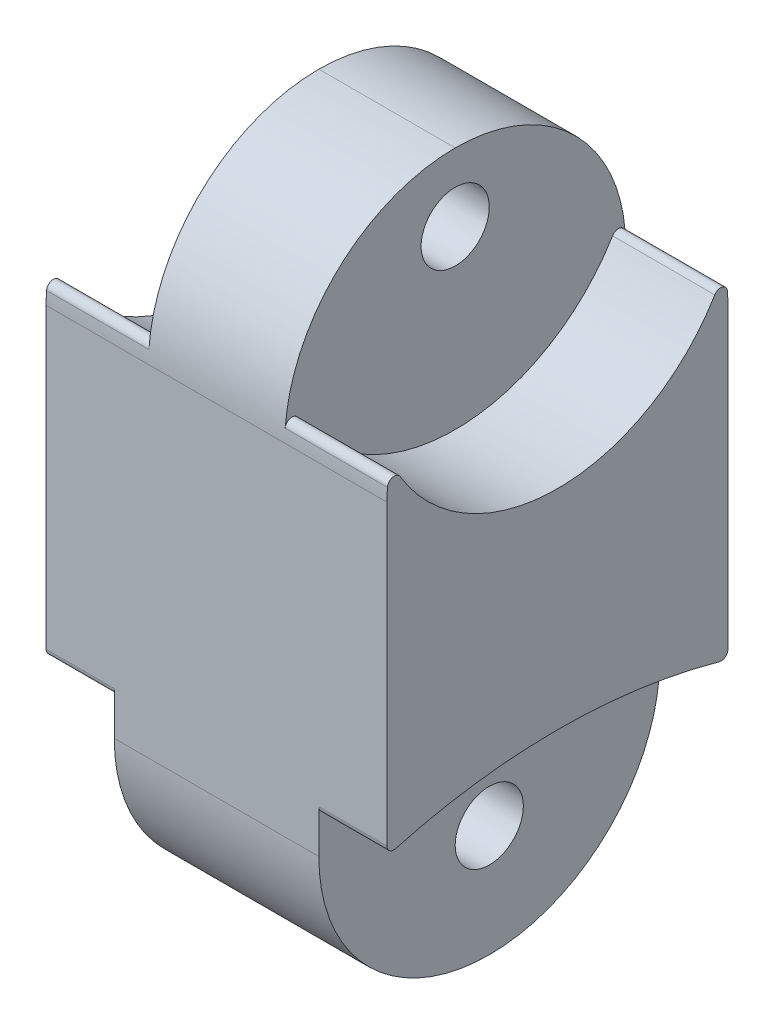
ISO-10303-21;
HEADER;
FILE_DESCRIPTION(('STEP AP214'),'2;1');
FILE_NAME('part.step','',(''),(''),'','','');
FILE_SCHEMA(('AUTOMOTIVE_DESIGN { 1 0 10303 214 1 1 1 1 }'));
ENDSEC;
DATA;
#1=APPLICATION_CONTEXT('core data for automotive mechanical design processes');
#2=APPLICATION_PROTOCOL_DEFINITION('international standard','automotive_design',2000,#1);
#3=PRODUCT_CONTEXT('',#1,'mechanical');
#4=PRODUCT('Part','Part','',(#3));
#5=PRODUCT_RELATED_PRODUCT_CATEGORY('part','',(#4));
#6=PRODUCT_DEFINITION_FORMATION('','',#4);
#7=PRODUCT_DEFINITION_CONTEXT('part definition',#1,'design');
#8=PRODUCT_DEFINITION('design','',#6,#7);
#9=PRODUCT_DEFINITION_SHAPE('','',#8);
#10=(LENGTH_UNIT() NAMED_UNIT(*) SI_UNIT(.MILLI.,.METRE.));
#11=(NAMED_UNIT(*) PLANE_ANGLE_UNIT() SI_UNIT($,.RADIAN.));
#12=(NAMED_UNIT(*) SI_UNIT($,.STERADIAN.) SOLID_ANGLE_UNIT());
#13=UNCERTAINTY_MEASURE_WITH_UNIT(LENGTH_MEASURE(1.E-05),#10,'distance_accuracy_value','');
#14=(GEOMETRIC_REPRESENTATION_CONTEXT(3) GLOBAL_UNCERTAINTY_ASSIGNED_CONTEXT((#13)) GLOBAL_UNIT_ASSIGNED_CONTEXT((#10,
#11,#12)) REPRESENTATION_CONTEXT('',''));
#15=CARTESIAN_POINT('',(0.,0.,0.));
#16=DIRECTION('',(0.,0.,1.));
#17=DIRECTION('',(1.,0.,0.));
#18=AXIS2_PLACEMENT_3D('',#15,#16,#17);
#19=CARTESIAN_POINT('',(25.,68.,50.));
#20=DIRECTION('',(-1.,0.,0.));
#21=DIRECTION('',(0.,-1.,0.));
#22=AXIS2_PLACEMENT_3D('',#19,#20,#21);
#23=PLANE('',#22);
#24=CARTESIAN_POINT('',(25.,63.,25.));
#25=DIRECTION('',(-1.,0.,0.));
#26=DIRECTION('',(0.,-1.,0.));
#27=AXIS2_PLACEMENT_3D('',#24,#25,#26);
#28=CIRCLE('',#27,25.);
#29=CARTESIAN_POINT('',(25.,63.,0.));
#30=VERTEX_POINT('',#29);
#31=CARTESIAN_POINT('',(25.,64.8511073090801,0.0686261563813927));
#32=VERTEX_POINT('',#31);
#33=EDGE_CURVE('E244',#30,#32,#28,.F.);
#34=ORIENTED_EDGE('',*,*,#33,.T.);
#35=CARTESIAN_POINT('',(25.,64.7770630167169,1.06588111012614));
#36=DIRECTION('',(-1.,0.,0.));
#37=DIRECTION('',(0.,-1.,0.));
#38=AXIS2_PLACEMENT_3D('',#35,#36,#37);
#39=CIRCLE('',#38,1.);
#40=CARTESIAN_POINT('',(25.,65.290599755512,1.92394871696593));
#41=VERTEX_POINT('',#40);
#42=EDGE_CURVE('E275',#32,#41,#39,.F.);
#43=ORIENTED_EDGE('',*,*,#42,.T.);
#44=CARTESIAN_POINT('',(25.,79.1011666918404,25.));
#45=DIRECTION('',(-1.,0.,0.));
#46=DIRECTION('',(0.,0.,1.));
#47=AXIS2_PLACEMENT_3D('',#44,#45,#46);
#48=CIRCLE('',#47,26.8930456051379);
#49=CARTESIAN_POINT('',(25.,65.290599755512,48.0760512830341));
#50=VERTEX_POINT('',#49);
#51=EDGE_CURVE('E384',#41,#50,#48,.T.);
#52=ORIENTED_EDGE('',*,*,#51,.T.);
#53=CARTESIAN_POINT('',(25.,64.7770630167169,48.9341188898739));
#54=DIRECTION('',(-1.,0.,0.));
#55=DIRECTION('',(0.,-1.,0.));
#56=AXIS2_PLACEMENT_3D('',#53,#54,#55);
#57=CIRCLE('',#56,1.);
#58=CARTESIAN_POINT('',(25.,64.8511073090801,49.9313738436186));
#59=VERTEX_POINT('',#58);
#60=EDGE_CURVE('E273',#50,#59,#57,.F.);
#61=ORIENTED_EDGE('',*,*,#60,.T.);
#62=CARTESIAN_POINT('',(25.,63.,25.));
#63=DIRECTION('',(-1.,0.,0.));
#64=DIRECTION('',(0.,-1.,0.));
#65=AXIS2_PLACEMENT_3D('',#62,#63,#64);
#66=CIRCLE('',#65,25.);
#67=CARTESIAN_POINT('',(25.,63.,50.));
#68=VERTEX_POINT('',#67);
#69=EDGE_CURVE('E241',#59,#68,#66,.F.);
#70=ORIENTED_EDGE('',*,*,#69,.T.);
#71=DIRECTION('',(0.,1.,0.));
#72=VECTOR('',#71,1.);
#73=CARTESIAN_POINT('',(25.,68.,50.));
#74=LINE('',#73,#72);
#75=CARTESIAN_POINT('',(25.,19.3251200181358,50.));
#76=VERTEX_POINT('',#75);
#77=EDGE_CURVE('E357',#76,#68,#74,.T.);
#78=ORIENTED_EDGE('',*,*,#77,.F.);
#79=CARTESIAN_POINT('',(25.,19.3251200181358,49.));
#80=DIRECTION('',(-1.,0.,0.));
#81=DIRECTION('',(0.,-1.,0.));
#82=AXIS2_PLACEMENT_3D('',#79,#80,#81);
#83=CIRCLE('',#82,1.);
#84=CARTESIAN_POINT('',(25.,18.3614720813736,48.7328246755894));
#85=VERTEX_POINT('',#84);
#86=EDGE_CURVE('E271',#76,#85,#83,.F.);
#87=ORIENTED_EDGE('',*,*,#86,.T.);
#88=CARTESIAN_POINT('',(25.,-67.2380778868951,25.));
#89=DIRECTION('',(-1.,0.,0.));
#90=DIRECTION('',(0.,0.,-1.));
#91=AXIS2_PLACEMENT_3D('',#88,#89,#90);
#92=CIRCLE('',#91,88.8286548465775);
#93=CARTESIAN_POINT('',(25.,18.3614720813736,1.26717532441057));
#94=VERTEX_POINT('',#93);
#95=EDGE_CURVE('E340',#85,#94,#92,.T.);
#96=ORIENTED_EDGE('',*,*,#95,.T.);
#97=CARTESIAN_POINT('',(25.,19.3251200181358,1.));
#98=DIRECTION('',(-1.,0.,0.));
#99=DIRECTION('',(0.,-1.,0.));
#100=AXIS2_PLACEMENT_3D('',#97,#98,#99);
#101=CIRCLE('',#100,1.);
#102=CARTESIAN_POINT('',(25.,19.3251200181358,0.));
#103=VERTEX_POINT('',#102);
#104=EDGE_CURVE('E269',#94,#103,#101,.F.);
#105=ORIENTED_EDGE('',*,*,#104,.T.);
#106=DIRECTION('',(0.,1.,0.));
#107=VECTOR('',#106,1.);
#108=CARTESIAN_POINT('',(25.,68.,0.));
#109=LINE('',#108,#107);
#110=EDGE_CURVE('E210',#103,#30,#109,.T.);
#111=ORIENTED_EDGE('',*,*,#110,.T.);
#112=EDGE_LOOP('',(#34,#43,#52,#61,#70,#78,#87,#96,#105,#111));
#113=FACE_BOUND('',#112,.T.);
#114=ADVANCED_FACE('F40',(#113),#23,.F.);
#115=CARTESIAN_POINT('',(15.,18.,50.));
#116=DIRECTION('',(-1.,0.,0.));
#117=DIRECTION('',(0.,-1.,0.));
#118=AXIS2_PLACEMENT_3D('',#115,#116,#117);
#119=PLANE('',#118);
#120=CARTESIAN_POINT('',(15.,4.41143371821271,25.));
#121=DIRECTION('',(-1.,0.,0.));
#122=DIRECTION('',(0.,-1.,0.));
#123=AXIS2_PLACEMENT_3D('',#120,#121,#122);
#124=CIRCLE('',#123,5.);
#125=CARTESIAN_POINT('',(15.,-0.588566281787291,25.));
#126=VERTEX_POINT('',#125);
#127=EDGE_CURVE('E225',#126,#126,#124,.T.);
#128=ORIENTED_EDGE('',*,*,#127,.T.);
#129=EDGE_LOOP('',(#128));
#130=FACE_BOUND('',#129,.T.);
#131=CARTESIAN_POINT('',(15.,13.,25.));
#132=DIRECTION('',(-1.,0.,0.));
#133=DIRECTION('',(0.,-1.,0.));
#134=AXIS2_PLACEMENT_3D('',#131,#132,#133);
#135=CIRCLE('',#134,25.);
#136=CARTESIAN_POINT('',(15.,13.,50.));
#137=VERTEX_POINT('',#136);
#138=CARTESIAN_POINT('',(15.,-12.,25.));
#139=VERTEX_POINT('',#138);
#140=EDGE_CURVE('E195',#137,#139,#135,.F.);
#141=ORIENTED_EDGE('',*,*,#140,.T.);
#142=CARTESIAN_POINT('',(15.,13.,25.));
#143=DIRECTION('',(-1.,0.,0.));
#144=DIRECTION('',(0.,-1.,0.));
#145=AXIS2_PLACEMENT_3D('',#142,#143,#144);
#146=CIRCLE('',#145,25.);
#147=CARTESIAN_POINT('',(15.,13.,0.));
#148=VERTEX_POINT('',#147);
#149=EDGE_CURVE('E188',#139,#148,#146,.F.);
#150=ORIENTED_EDGE('',*,*,#149,.T.);
#151=DIRECTION('',(0.,1.,0.));
#152=VECTOR('',#151,1.);
#153=CARTESIAN_POINT('',(15.,18.,0.));
#154=LINE('',#153,#152);
#155=CARTESIAN_POINT('',(15.,19.3251200181358,0.));
#156=VERTEX_POINT('',#155);
#157=EDGE_CURVE('E191',#148,#156,#154,.T.);
#158=ORIENTED_EDGE('',*,*,#157,.T.);
#159=CARTESIAN_POINT('',(15.,19.3251200181358,1.));
#160=DIRECTION('',(-1.,0.,0.));
#161=DIRECTION('',(0.,-1.,0.));
#162=AXIS2_PLACEMENT_3D('',#159,#160,#161);
#163=CIRCLE('',#162,1.);
#164=CARTESIAN_POINT('',(15.,18.3614720813736,1.26717532441057));
#165=VERTEX_POINT('',#164);
#166=EDGE_CURVE('E327',#156,#165,#163,.T.);
#167=ORIENTED_EDGE('',*,*,#166,.T.);
#168=CARTESIAN_POINT('',(15.,-67.2380778868951,25.));
#169=DIRECTION('',(-1.,0.,0.));
#170=DIRECTION('',(0.,0.,-1.));
#171=AXIS2_PLACEMENT_3D('',#168,#169,#170);
#172=CIRCLE('',#171,88.8286548465775);
#173=CARTESIAN_POINT('',(15.,18.3614720813736,48.7328246755894));
#174=VERTEX_POINT('',#173);
#175=EDGE_CURVE('E330',#174,#165,#172,.T.);
#176=ORIENTED_EDGE('',*,*,#175,.F.);
#177=CARTESIAN_POINT('',(15.,19.3251200181358,49.));
#178=DIRECTION('',(-1.,0.,0.));
#179=DIRECTION('',(0.,-1.,0.));
#180=AXIS2_PLACEMENT_3D('',#177,#178,#179);
#181=CIRCLE('',#180,1.);
#182=CARTESIAN_POINT('',(15.,19.3251200181358,50.));
#183=VERTEX_POINT('',#182);
#184=EDGE_CURVE('E324',#174,#183,#181,.T.);
#185=ORIENTED_EDGE('',*,*,#184,.T.);
#186=DIRECTION('',(0.,1.,0.));
#187=VECTOR('',#186,1.);
#188=CARTESIAN_POINT('',(15.,-12.,50.));
#189=LINE('',#188,#187);
#190=EDGE_CURVE('E361',#137,#183,#189,.T.);
#191=ORIENTED_EDGE('',*,*,#190,.F.);
#192=EDGE_LOOP('',(#141,#150,#158,#167,#176,#185,#191));
#193=FACE_BOUND('',#192,.T.);
#194=ADVANCED_FACE('F190',(#130,#193),#119,.F.);
#195=CARTESIAN_POINT('',(10.,88.,50.));
#196=DIRECTION('',(-1.,0.,0.));
#197=DIRECTION('',(0.,-1.,0.));
#198=AXIS2_PLACEMENT_3D('',#195,#196,#197);
#199=PLANE('',#198);
#200=CARTESIAN_POINT('',(10.,78.,25.));
#201=DIRECTION('',(-1.,0.,0.));
#202=DIRECTION('',(0.,-1.,0.));
#203=AXIS2_PLACEMENT_3D('',#200,#201,#202);
#204=CIRCLE('',#203,5.);
#205=CARTESIAN_POINT('',(10.,73.,25.));
#206=VERTEX_POINT('',#205);
#207=EDGE_CURVE('E372',#206,#206,#204,.T.);
#208=ORIENTED_EDGE('',*,*,#207,.T.);
#209=EDGE_LOOP('',(#208));
#210=FACE_BOUND('',#209,.T.);
#211=CARTESIAN_POINT('',(10.,63.,25.));
#212=DIRECTION('',(-1.,0.,0.));
#213=DIRECTION('',(0.,-1.,0.));
#214=AXIS2_PLACEMENT_3D('',#211,#212,#213);
#215=CIRCLE('',#214,25.);
#216=CARTESIAN_POINT('',(10.,88.,25.));
#217=VERTEX_POINT('',#216);
#218=CARTESIAN_POINT('',(10.,64.8511073090801,49.9313738436186));
#219=VERTEX_POINT('',#218);
#220=EDGE_CURVE('E247',#217,#219,#215,.F.);
#221=ORIENTED_EDGE('',*,*,#220,.T.);
#222=CARTESIAN_POINT('',(10.,64.7770630167169,48.9341188898739));
#223=DIRECTION('',(-1.,0.,0.));
#224=DIRECTION('',(0.,-1.,0.));
#225=AXIS2_PLACEMENT_3D('',#222,#223,#224);
#226=CIRCLE('',#225,1.);
#227=CARTESIAN_POINT('',(10.,65.290599755512,48.0760512830341));
#228=VERTEX_POINT('',#227);
#229=EDGE_CURVE('E317',#219,#228,#226,.T.);
#230=ORIENTED_EDGE('',*,*,#229,.T.);
#231=CARTESIAN_POINT('',(10.,79.1011666918404,25.));
#232=DIRECTION('',(-1.,0.,0.));
#233=DIRECTION('',(0.,0.,1.));
#234=AXIS2_PLACEMENT_3D('',#231,#232,#233);
#235=CIRCLE('',#234,26.8930456051379);
#236=CARTESIAN_POINT('',(10.,65.290599755512,1.92394871696593));
#237=VERTEX_POINT('',#236);
#238=EDGE_CURVE('E381',#237,#228,#235,.T.);
#239=ORIENTED_EDGE('',*,*,#238,.F.);
#240=CARTESIAN_POINT('',(10.,64.7770630167169,1.06588111012614));
#241=DIRECTION('',(-1.,0.,0.));
#242=DIRECTION('',(0.,-1.,0.));
#243=AXIS2_PLACEMENT_3D('',#240,#241,#242);
#244=CIRCLE('',#243,1.);
#245=CARTESIAN_POINT('',(10.,64.8511073090801,0.0686261563813926));
#246=VERTEX_POINT('',#245);
#247=EDGE_CURVE('E314',#237,#246,#244,.T.);
#248=ORIENTED_EDGE('',*,*,#247,.T.);
#249=CARTESIAN_POINT('',(10.,63.,25.));
#250=DIRECTION('',(-1.,0.,0.));
#251=DIRECTION('',(0.,-1.,0.));
#252=AXIS2_PLACEMENT_3D('',#249,#250,#251);
#253=CIRCLE('',#252,25.);
#254=EDGE_CURVE('E249',#246,#217,#253,.F.);
#255=ORIENTED_EDGE('',*,*,#254,.T.);
#256=EDGE_LOOP('',(#221,#230,#239,#248,#255));
#257=FACE_BOUND('',#256,.T.);
#258=ADVANCED_FACE('F440',(#210,#257),#199,.F.);
#259=CARTESIAN_POINT('',(-10.,68.,50.));
#260=DIRECTION('',(1.,0.,0.));
#261=DIRECTION('',(0.,1.,0.));
#262=AXIS2_PLACEMENT_3D('',#259,#260,#261);
#263=PLANE('',#262);
#264=CARTESIAN_POINT('',(-10.,78.,25.));
#265=DIRECTION('',(-1.,0.,0.));
#266=DIRECTION('',(0.,-1.,0.));
#267=AXIS2_PLACEMENT_3D('',#264,#265,#266);
#268=CIRCLE('',#267,5.);
#269=CARTESIAN_POINT('',(-10.,73.,25.));
#270=VERTEX_POINT('',#269);
#271=EDGE_CURVE('E257',#270,#270,#268,.T.);
#272=ORIENTED_EDGE('',*,*,#271,.F.);
#273=EDGE_LOOP('',(#272));
#274=FACE_BOUND('',#273,.T.);
#275=CARTESIAN_POINT('',(-10.,63.,25.));
#276=DIRECTION('',(1.,0.,0.));
#277=DIRECTION('',(0.,1.,0.));
#278=AXIS2_PLACEMENT_3D('',#275,#276,#277);
#279=CIRCLE('',#278,25.);
#280=CARTESIAN_POINT('',(-10.,64.8511073090801,49.9313738436186));
#281=VERTEX_POINT('',#280);
#282=CARTESIAN_POINT('',(-10.,88.,25.));
#283=VERTEX_POINT('',#282);
#284=EDGE_CURVE('E223',#281,#283,#279,.F.);
#285=ORIENTED_EDGE('',*,*,#284,.T.);
#286=CARTESIAN_POINT('',(-10.,63.,25.));
#287=DIRECTION('',(1.,0.,0.));
#288=DIRECTION('',(0.,1.,0.));
#289=AXIS2_PLACEMENT_3D('',#286,#287,#288);
#290=CIRCLE('',#289,25.);
#291=CARTESIAN_POINT('',(-10.,64.8511073090801,0.0686261563813927));
#292=VERTEX_POINT('',#291);
#293=EDGE_CURVE('E231',#283,#292,#290,.F.);
#294=ORIENTED_EDGE('',*,*,#293,.T.);
#295=CARTESIAN_POINT('',(-10.,64.7770630167169,1.06588111012614));
#296=DIRECTION('',(1.,0.,0.));
#297=DIRECTION('',(0.,1.,0.));
#298=AXIS2_PLACEMENT_3D('',#295,#296,#297);
#299=CIRCLE('',#298,1.);
#300=CARTESIAN_POINT('',(-10.,65.290599755512,1.92394871696593));
#301=VERTEX_POINT('',#300);
#302=EDGE_CURVE('E322',#292,#301,#299,.T.);
#303=ORIENTED_EDGE('',*,*,#302,.T.);
#304=CARTESIAN_POINT('',(-10.,79.1011666918404,25.));
#305=DIRECTION('',(-1.,0.,0.));
#306=DIRECTION('',(0.,0.,1.));
#307=AXIS2_PLACEMENT_3D('',#304,#305,#306);
#308=CIRCLE('',#307,26.8930456051379);
#309=CARTESIAN_POINT('',(-10.,65.290599755512,48.0760512830341));
#310=VERTEX_POINT('',#309);
#311=EDGE_CURVE('E258',#301,#310,#308,.T.);
#312=ORIENTED_EDGE('',*,*,#311,.T.);
#313=CARTESIAN_POINT('',(-10.,64.7770630167169,48.9341188898739));
#314=DIRECTION('',(1.,0.,0.));
#315=DIRECTION('',(0.,1.,0.));
#316=AXIS2_PLACEMENT_3D('',#313,#314,#315);
#317=CIRCLE('',#316,1.);
#318=EDGE_CURVE('E319',#310,#281,#317,.T.);
#319=ORIENTED_EDGE('',*,*,#318,.T.);
#320=EDGE_LOOP('',(#285,#294,#303,#312,#319));
#321=FACE_BOUND('',#320,.T.);
#322=ADVANCED_FACE('F620',(#274,#321),#263,.F.);
#323=CARTESIAN_POINT('',(-25.,18.,50.));
#324=DIRECTION('',(1.,0.,0.));
#325=DIRECTION('',(0.,1.,0.));
#326=AXIS2_PLACEMENT_3D('',#323,#324,#325);
#327=PLANE('',#326);
#328=CARTESIAN_POINT('',(-25.,63.,25.));
#329=DIRECTION('',(1.,0.,0.));
#330=DIRECTION('',(0.,1.,0.));
#331=AXIS2_PLACEMENT_3D('',#328,#329,#330);
#332=CIRCLE('',#331,25.);
#333=CARTESIAN_POINT('',(-25.,63.,50.));
#334=VERTEX_POINT('',#333);
#335=CARTESIAN_POINT('',(-25.,64.8511073090801,49.9313738436186));
#336=VERTEX_POINT('',#335);
#337=EDGE_CURVE('E233',#334,#336,#332,.F.);
#338=ORIENTED_EDGE('',*,*,#337,.T.);
#339=CARTESIAN_POINT('',(-25.,64.7770630167169,48.9341188898739));
#340=DIRECTION('',(1.,0.,0.));
#341=DIRECTION('',(0.,1.,0.));
#342=AXIS2_PLACEMENT_3D('',#339,#340,#341);
#343=CIRCLE('',#342,1.);
#344=CARTESIAN_POINT('',(-25.,65.290599755512,48.0760512830341));
#345=VERTEX_POINT('',#344);
#346=EDGE_CURVE('E294',#336,#345,#343,.F.);
#347=ORIENTED_EDGE('',*,*,#346,.T.);
#348=CARTESIAN_POINT('',(-25.,79.1011666918404,25.));
#349=DIRECTION('',(-1.,0.,0.));
#350=DIRECTION('',(0.,0.,1.));
#351=AXIS2_PLACEMENT_3D('',#348,#349,#350);
#352=CIRCLE('',#351,26.8930456051379);
#353=CARTESIAN_POINT('',(-25.,65.290599755512,1.92394871696593));
#354=VERTEX_POINT('',#353);
#355=EDGE_CURVE('E378',#354,#345,#352,.T.);
#356=ORIENTED_EDGE('',*,*,#355,.F.);
#357=CARTESIAN_POINT('',(-25.,64.7770630167169,1.06588111012614));
#358=DIRECTION('',(1.,0.,0.));
#359=DIRECTION('',(0.,1.,0.));
#360=AXIS2_PLACEMENT_3D('',#357,#358,#359);
#361=CIRCLE('',#360,1.);
#362=CARTESIAN_POINT('',(-25.,64.8511073090801,0.0686261563813927));
#363=VERTEX_POINT('',#362);
#364=EDGE_CURVE('E292',#354,#363,#361,.F.);
#365=ORIENTED_EDGE('',*,*,#364,.T.);
#366=CARTESIAN_POINT('',(-25.,63.,25.));
#367=DIRECTION('',(1.,0.,0.));
#368=DIRECTION('',(0.,1.,0.));
#369=AXIS2_PLACEMENT_3D('',#366,#367,#368);
#370=CIRCLE('',#369,25.);
#371=CARTESIAN_POINT('',(-25.,63.,0.));
#372=VERTEX_POINT('',#371);
#373=EDGE_CURVE('E236',#363,#372,#370,.F.);
#374=ORIENTED_EDGE('',*,*,#373,.T.);
#375=DIRECTION('',(0.,-1.,0.));
#376=VECTOR('',#375,1.);
#377=CARTESIAN_POINT('',(-25.,18.,0.));
#378=LINE('',#377,#376);
#379=CARTESIAN_POINT('',(-25.,19.3251200181358,0.));
#380=VERTEX_POINT('',#379);
#381=EDGE_CURVE('E347',#372,#380,#378,.T.);
#382=ORIENTED_EDGE('',*,*,#381,.T.);
#383=CARTESIAN_POINT('',(-25.,19.3251200181358,1.));
#384=DIRECTION('',(1.,0.,0.));
#385=DIRECTION('',(0.,1.,0.));
#386=AXIS2_PLACEMENT_3D('',#383,#384,#385);
#387=CIRCLE('',#386,1.);
#388=CARTESIAN_POINT('',(-25.,18.3614720813736,1.26717532441057));
#389=VERTEX_POINT('',#388);
#390=EDGE_CURVE('E288',#380,#389,#387,.F.);
#391=ORIENTED_EDGE('',*,*,#390,.T.);
#392=CARTESIAN_POINT('',(-25.,-67.2380778868951,25.));
#393=DIRECTION('',(-1.,0.,0.));
#394=DIRECTION('',(0.,0.,-1.));
#395=AXIS2_PLACEMENT_3D('',#392,#393,#394);
#396=CIRCLE('',#395,88.8286548465775);
#397=CARTESIAN_POINT('',(-25.,18.3614720813736,48.7328246755894));
#398=VERTEX_POINT('',#397);
#399=EDGE_CURVE('E339',#398,#389,#396,.T.);
#400=ORIENTED_EDGE('',*,*,#399,.F.);
#401=CARTESIAN_POINT('',(-25.,19.3251200181358,49.));
#402=DIRECTION('',(1.,0.,0.));
#403=DIRECTION('',(0.,1.,0.));
#404=AXIS2_PLACEMENT_3D('',#401,#402,#403);
#405=CIRCLE('',#404,1.);
#406=CARTESIAN_POINT('',(-25.,19.3251200181358,50.));
#407=VERTEX_POINT('',#406);
#408=EDGE_CURVE('E290',#398,#407,#405,.F.);
#409=ORIENTED_EDGE('',*,*,#408,.T.);
#410=DIRECTION('',(0.,-1.,0.));
#411=VECTOR('',#410,1.);
#412=CARTESIAN_POINT('',(-25.,18.,50.));
#413=LINE('',#412,#411);
#414=EDGE_CURVE('E355',#334,#407,#413,.T.);
#415=ORIENTED_EDGE('',*,*,#414,.F.);
#416=EDGE_LOOP('',(#338,#347,#356,#365,#374,#382,#391,#400,#409,#415));
#417=FACE_BOUND('',#416,.T.);
#418=ADVANCED_FACE('F408',(#417),#327,.F.);
#419=CARTESIAN_POINT('',(-15.,3.,50.));
#420=DIRECTION('',(1.,0.,0.));
#421=DIRECTION('',(0.,1.,0.));
#422=AXIS2_PLACEMENT_3D('',#419,#420,#421);
#423=PLANE('',#422);
#424=CARTESIAN_POINT('',(-15.,4.41143371821272,25.));
#425=DIRECTION('',(1.,0.,0.));
#426=DIRECTION('',(0.,1.,0.));
#427=AXIS2_PLACEMENT_3D('',#424,#425,#426);
#428=CIRCLE('',#427,5.);
#429=CARTESIAN_POINT('',(-15.,9.41143371821272,25.));
#430=VERTEX_POINT('',#429);
#431=EDGE_CURVE('E226',#430,#430,#428,.T.);
#432=ORIENTED_EDGE('',*,*,#431,.T.);
#433=EDGE_LOOP('',(#432));
#434=FACE_BOUND('',#433,.T.);
#435=DIRECTION('',(0.,-1.,0.));
#436=VECTOR('',#435,1.);
#437=CARTESIAN_POINT('',(-15.,3.,0.));
#438=LINE('',#437,#436);
#439=CARTESIAN_POINT('',(-15.,19.3251200181358,0.));
#440=VERTEX_POINT('',#439);
#441=CARTESIAN_POINT('',(-15.,13.,0.));
#442=VERTEX_POINT('',#441);
#443=EDGE_CURVE('E350',#440,#442,#438,.T.);
#444=ORIENTED_EDGE('',*,*,#443,.T.);
#445=CARTESIAN_POINT('',(-15.,13.,25.));
#446=DIRECTION('',(1.,0.,0.));
#447=DIRECTION('',(0.,1.,0.));
#448=AXIS2_PLACEMENT_3D('',#445,#446,#447);
#449=CIRCLE('',#448,25.);
#450=CARTESIAN_POINT('',(-15.,-12.,25.));
#451=VERTEX_POINT('',#450);
#452=EDGE_CURVE('E214',#442,#451,#449,.F.);
#453=ORIENTED_EDGE('',*,*,#452,.T.);
#454=CARTESIAN_POINT('',(-15.,13.,25.));
#455=DIRECTION('',(1.,0.,0.));
#456=DIRECTION('',(0.,1.,0.));
#457=AXIS2_PLACEMENT_3D('',#454,#455,#456);
#458=CIRCLE('',#457,25.);
#459=CARTESIAN_POINT('',(-15.,13.,50.));
#460=VERTEX_POINT('',#459);
#461=EDGE_CURVE('E215',#451,#460,#458,.F.);
#462=ORIENTED_EDGE('',*,*,#461,.T.);
#463=DIRECTION('',(0.,-1.,0.));
#464=VECTOR('',#463,1.);
#465=CARTESIAN_POINT('',(-15.,3.,50.));
#466=LINE('',#465,#464);
#467=CARTESIAN_POINT('',(-15.,19.3251200181358,50.));
#468=VERTEX_POINT('',#467);
#469=EDGE_CURVE('E354',#468,#460,#466,.T.);
#470=ORIENTED_EDGE('',*,*,#469,.F.);
#471=CARTESIAN_POINT('',(-15.,19.3251200181358,49.));
#472=DIRECTION('',(1.,0.,0.));
#473=DIRECTION('',(0.,1.,0.));
#474=AXIS2_PLACEMENT_3D('',#471,#472,#473);
#475=CIRCLE('',#474,1.);
#476=CARTESIAN_POINT('',(-15.,18.3614720813736,48.7328246755894));
#477=VERTEX_POINT('',#476);
#478=EDGE_CURVE('E48',#468,#477,#475,.T.);
#479=ORIENTED_EDGE('',*,*,#478,.T.);
#480=CARTESIAN_POINT('',(-15.,-67.2380778868951,25.));
#481=DIRECTION('',(-1.,0.,0.));
#482=DIRECTION('',(0.,0.,-1.));
#483=AXIS2_PLACEMENT_3D('',#480,#481,#482);
#484=CIRCLE('',#483,88.8286548465775);
#485=CARTESIAN_POINT('',(-15.,18.3614720813736,1.26717532441057));
#486=VERTEX_POINT('',#485);
#487=EDGE_CURVE('E229',#477,#486,#484,.T.);
#488=ORIENTED_EDGE('',*,*,#487,.T.);
#489=CARTESIAN_POINT('',(-15.,19.3251200181358,1.));
#490=DIRECTION('',(1.,0.,0.));
#491=DIRECTION('',(0.,1.,0.));
#492=AXIS2_PLACEMENT_3D('',#489,#490,#491);
#493=CIRCLE('',#492,1.);
#494=EDGE_CURVE('E11',#486,#440,#493,.T.);
#495=ORIENTED_EDGE('',*,*,#494,.T.);
#496=EDGE_LOOP('',(#444,#453,#462,#470,#479,#488,#495));
#497=FACE_BOUND('',#496,.T.);
#498=ADVANCED_FACE('F419',(#434,#497),#423,.F.);
#499=CARTESIAN_POINT('',(0.,0.,50.));
#500=DIRECTION('',(0.,0.,1.));
#501=DIRECTION('',(1.,0.,0.));
#502=AXIS2_PLACEMENT_3D('',#499,#500,#501);
#503=PLANE('',#502);
#504=ORIENTED_EDGE('',*,*,#190,.T.);
#505=DIRECTION('',(1.,0.,0.));
#506=VECTOR('',#505,1.);
#507=CARTESIAN_POINT('',(0.,19.3251200181358,50.));
#508=LINE('',#507,#506);
#509=EDGE_CURVE('E299',#183,#76,#508,.T.);
#510=ORIENTED_EDGE('',*,*,#509,.T.);
#511=ORIENTED_EDGE('',*,*,#77,.T.);
#512=DIRECTION('',(-1.,0.,0.));
#513=VECTOR('',#512,1.);
#514=CARTESIAN_POINT('',(-10.,63.,50.));
#515=LINE('',#514,#513);
#516=EDGE_CURVE('E251',#68,#334,#515,.T.);
#517=ORIENTED_EDGE('',*,*,#516,.T.);
#518=ORIENTED_EDGE('',*,*,#414,.T.);
#519=DIRECTION('',(1.,0.,0.));
#520=VECTOR('',#519,1.);
#521=CARTESIAN_POINT('',(-15.,19.3251200181358,50.));
#522=LINE('',#521,#520);
#523=EDGE_CURVE('E296',#407,#468,#522,.T.);
#524=ORIENTED_EDGE('',*,*,#523,.T.);
#525=ORIENTED_EDGE('',*,*,#469,.T.);
#526=DIRECTION('',(1.,0.,0.));
#527=VECTOR('',#526,1.);
#528=CARTESIAN_POINT('',(15.,13.,50.));
#529=LINE('',#528,#527);
#530=EDGE_CURVE('E221',#460,#137,#529,.T.);
#531=ORIENTED_EDGE('',*,*,#530,.T.);
#532=EDGE_LOOP('',(#504,#510,#511,#517,#518,#524,#525,#531));
#533=FACE_BOUND('',#532,.T.);
#534=ADVANCED_FACE('F406',(#533),#503,.T.);
#535=CARTESIAN_POINT('',(0.,0.,0.));
#536=DIRECTION('',(0.,0.,1.));
#537=DIRECTION('',(1.,0.,0.));
#538=AXIS2_PLACEMENT_3D('',#535,#536,#537);
#539=PLANE('',#538);
#540=ORIENTED_EDGE('',*,*,#110,.F.);
#541=DIRECTION('',(-1.,0.,0.));
#542=VECTOR('',#541,1.);
#543=CARTESIAN_POINT('',(15.,19.3251200181358,0.));
#544=LINE('',#543,#542);
#545=EDGE_CURVE('E208',#103,#156,#544,.T.);
#546=ORIENTED_EDGE('',*,*,#545,.T.);
#547=ORIENTED_EDGE('',*,*,#157,.F.);
#548=DIRECTION('',(1.,0.,0.));
#549=VECTOR('',#548,1.);
#550=CARTESIAN_POINT('',(0.,13.,0.));
#551=LINE('',#550,#549);
#552=EDGE_CURVE('E200',#148,#442,#551,.F.);
#553=ORIENTED_EDGE('',*,*,#552,.T.);
#554=ORIENTED_EDGE('',*,*,#443,.F.);
#555=DIRECTION('',(-1.,0.,0.));
#556=VECTOR('',#555,1.);
#557=CARTESIAN_POINT('',(0.,19.3251200181358,0.));
#558=LINE('',#557,#556);
#559=EDGE_CURVE('E307',#440,#380,#558,.T.);
#560=ORIENTED_EDGE('',*,*,#559,.T.);
#561=ORIENTED_EDGE('',*,*,#381,.F.);
#562=DIRECTION('',(-1.,0.,0.));
#563=VECTOR('',#562,1.);
#564=CARTESIAN_POINT('',(0.,63.,0.));
#565=LINE('',#564,#563);
#566=EDGE_CURVE('E238',#372,#30,#565,.F.);
#567=ORIENTED_EDGE('',*,*,#566,.T.);
#568=EDGE_LOOP('',(#540,#546,#547,#553,#554,#560,#561,#567));
#569=FACE_BOUND('',#568,.T.);
#570=ADVANCED_FACE('F205',(#569),#539,.F.);
#571=CARTESIAN_POINT('',(0.,13.,25.));
#572=DIRECTION('',(-1.,0.,0.));
#573=DIRECTION('',(0.,0.,1.));
#574=AXIS2_PLACEMENT_3D('',#571,#572,#573);
#575=CYLINDRICAL_SURFACE('',#574,25.);
#576=ORIENTED_EDGE('',*,*,#530,.F.);
#577=ORIENTED_EDGE('',*,*,#461,.F.);
#578=DIRECTION('',(1.,0.,0.));
#579=VECTOR('',#578,1.);
#580=CARTESIAN_POINT('',(-15.,-12.,25.));
#581=LINE('',#580,#579);
#582=EDGE_CURVE('E211',#139,#451,#581,.F.);
#583=ORIENTED_EDGE('',*,*,#582,.F.);
#584=ORIENTED_EDGE('',*,*,#140,.F.);
#585=EDGE_LOOP('',(#576,#577,#583,#584));
#586=FACE_BOUND('',#585,.T.);
#587=ADVANCED_FACE('F418',(#586),#575,.T.);
#588=CARTESIAN_POINT('',(-15.,13.,25.));
#589=DIRECTION('',(1.,0.,0.));
#590=DIRECTION('',(0.,0.,-1.));
#591=AXIS2_PLACEMENT_3D('',#588,#589,#590);
#592=CYLINDRICAL_SURFACE('',#591,25.);
#593=ORIENTED_EDGE('',*,*,#452,.F.);
#594=ORIENTED_EDGE('',*,*,#552,.F.);
#595=ORIENTED_EDGE('',*,*,#149,.F.);
#596=ORIENTED_EDGE('',*,*,#582,.T.);
#597=EDGE_LOOP('',(#593,#594,#595,#596));
#598=FACE_BOUND('',#597,.T.);
#599=ADVANCED_FACE('F213',(#598),#592,.T.);
#600=CARTESIAN_POINT('',(-25.,4.41143371821272,25.));
#601=DIRECTION('',(1.,0.,0.));
#602=DIRECTION('',(0.,1.,0.));
#603=AXIS2_PLACEMENT_3D('',#600,#601,#602);
#604=CYLINDRICAL_SURFACE('',#603,5.);
#605=ORIENTED_EDGE('',*,*,#431,.F.);
#606=EDGE_LOOP('',(#605));
#607=FACE_BOUND('',#606,.T.);
#608=ORIENTED_EDGE('',*,*,#127,.F.);
#609=EDGE_LOOP('',(#608));
#610=FACE_BOUND('',#609,.T.);
#611=ADVANCED_FACE('F425',(#607,#610),#604,.F.);
#612=CARTESIAN_POINT('',(-15.,-67.2380778868951,25.));
#613=DIRECTION('',(-1.,0.,0.));
#614=DIRECTION('',(0.,0.,1.));
#615=AXIS2_PLACEMENT_3D('',#612,#613,#614);
#616=CYLINDRICAL_SURFACE('',#615,88.8286548465775);
#617=ORIENTED_EDGE('',*,*,#487,.F.);
#618=DIRECTION('',(-1.,0.,0.));
#619=VECTOR('',#618,1.);
#620=CARTESIAN_POINT('',(-15.,18.3614720813736,48.7328246755894));
#621=LINE('',#620,#619);
#622=EDGE_CURVE('E312',#477,#398,#621,.T.);
#623=ORIENTED_EDGE('',*,*,#622,.T.);
#624=ORIENTED_EDGE('',*,*,#399,.T.);
#625=DIRECTION('',(-1.,0.,0.));
#626=VECTOR('',#625,1.);
#627=CARTESIAN_POINT('',(-15.,18.3614720813736,1.26717532441057));
#628=LINE('',#627,#626);
#629=EDGE_CURVE('E310',#389,#486,#628,.F.);
#630=ORIENTED_EDGE('',*,*,#629,.T.);
#631=EDGE_LOOP('',(#617,#623,#624,#630));
#632=FACE_BOUND('',#631,.T.);
#633=ADVANCED_FACE('F423',(#632),#616,.F.);
#634=CARTESIAN_POINT('',(15.,-67.2380778868951,25.));
#635=DIRECTION('',(1.,0.,0.));
#636=DIRECTION('',(0.,0.,-1.));
#637=AXIS2_PLACEMENT_3D('',#634,#635,#636);
#638=CYLINDRICAL_SURFACE('',#637,88.8286548465775);
#639=ORIENTED_EDGE('',*,*,#95,.F.);
#640=DIRECTION('',(1.,0.,0.));
#641=VECTOR('',#640,1.);
#642=CARTESIAN_POINT('',(15.,18.3614720813736,48.7328246755894));
#643=LINE('',#642,#641);
#644=EDGE_CURVE('E305',#85,#174,#643,.F.);
#645=ORIENTED_EDGE('',*,*,#644,.T.);
#646=ORIENTED_EDGE('',*,*,#175,.T.);
#647=DIRECTION('',(1.,0.,0.));
#648=VECTOR('',#647,1.);
#649=CARTESIAN_POINT('',(15.,18.3614720813736,1.26717532441057));
#650=LINE('',#649,#648);
#651=EDGE_CURVE('E302',#165,#94,#650,.T.);
#652=ORIENTED_EDGE('',*,*,#651,.T.);
#653=EDGE_LOOP('',(#639,#645,#646,#652));
#654=FACE_BOUND('',#653,.T.);
#655=ADVANCED_FACE('F336',(#654),#638,.F.);
#656=CARTESIAN_POINT('',(25.,78.,25.));
#657=DIRECTION('',(-1.,0.,0.));
#658=DIRECTION('',(0.,-1.,0.));
#659=AXIS2_PLACEMENT_3D('',#656,#657,#658);
#660=CYLINDRICAL_SURFACE('',#659,5.);
#661=ORIENTED_EDGE('',*,*,#271,.T.);
#662=EDGE_LOOP('',(#661));
#663=FACE_BOUND('',#662,.T.);
#664=ORIENTED_EDGE('',*,*,#207,.F.);
#665=EDGE_LOOP('',(#664));
#666=FACE_BOUND('',#665,.T.);
#667=ADVANCED_FACE('F431',(#663,#666),#660,.F.);
#668=CARTESIAN_POINT('',(0.,63.,25.));
#669=DIRECTION('',(1.,0.,0.));
#670=DIRECTION('',(0.,0.,-1.));
#671=AXIS2_PLACEMENT_3D('',#668,#669,#670);
#672=CYLINDRICAL_SURFACE('',#671,25.);
#673=ORIENTED_EDGE('',*,*,#69,.F.);
#674=DIRECTION('',(1.,0.,0.));
#675=VECTOR('',#674,1.);
#676=CARTESIAN_POINT('',(0.,64.8511073090801,49.9313738436186));
#677=LINE('',#676,#675);
#678=EDGE_CURVE('E279',#59,#219,#677,.F.);
#679=ORIENTED_EDGE('',*,*,#678,.T.);
#680=ORIENTED_EDGE('',*,*,#220,.F.);
#681=DIRECTION('',(-1.,0.,0.));
#682=VECTOR('',#681,1.);
#683=CARTESIAN_POINT('',(10.,88.,25.));
#684=LINE('',#683,#682);
#685=EDGE_CURVE('E254',#283,#217,#684,.F.);
#686=ORIENTED_EDGE('',*,*,#685,.F.);
#687=ORIENTED_EDGE('',*,*,#284,.F.);
#688=DIRECTION('',(1.,0.,0.));
#689=VECTOR('',#688,1.);
#690=CARTESIAN_POINT('',(0.,64.8511073090801,49.9313738436186));
#691=LINE('',#690,#689);
#692=EDGE_CURVE('E277',#281,#336,#691,.F.);
#693=ORIENTED_EDGE('',*,*,#692,.T.);
#694=ORIENTED_EDGE('',*,*,#337,.F.);
#695=ORIENTED_EDGE('',*,*,#516,.F.);
#696=EDGE_LOOP('',(#673,#679,#680,#686,#687,#693,#694,#695));
#697=FACE_BOUND('',#696,.T.);
#698=ADVANCED_FACE('F403',(#697),#672,.T.);
#699=CARTESIAN_POINT('',(-10.,63.,25.));
#700=DIRECTION('',(-1.,0.,0.));
#701=DIRECTION('',(0.,0.,1.));
#702=AXIS2_PLACEMENT_3D('',#699,#700,#701);
#703=CYLINDRICAL_SURFACE('',#702,25.);
#704=ORIENTED_EDGE('',*,*,#254,.F.);
#705=DIRECTION('',(-1.,0.,0.));
#706=VECTOR('',#705,1.);
#707=CARTESIAN_POINT('',(-10.,64.8511073090801,0.0686261563813892));
#708=LINE('',#707,#706);
#709=EDGE_CURVE('E267',#246,#32,#708,.F.);
#710=ORIENTED_EDGE('',*,*,#709,.T.);
#711=ORIENTED_EDGE('',*,*,#33,.F.);
#712=ORIENTED_EDGE('',*,*,#566,.F.);
#713=ORIENTED_EDGE('',*,*,#373,.F.);
#714=DIRECTION('',(-1.,0.,0.));
#715=VECTOR('',#714,1.);
#716=CARTESIAN_POINT('',(-10.,64.8511073090801,0.0686261563813892));
#717=LINE('',#716,#715);
#718=EDGE_CURVE('E264',#363,#292,#717,.F.);
#719=ORIENTED_EDGE('',*,*,#718,.T.);
#720=ORIENTED_EDGE('',*,*,#293,.F.);
#721=ORIENTED_EDGE('',*,*,#685,.T.);
#722=EDGE_LOOP('',(#704,#710,#711,#712,#713,#719,#720,#721));
#723=FACE_BOUND('',#722,.T.);
#724=ADVANCED_FACE('F450',(#723),#703,.T.);
#725=CARTESIAN_POINT('',(-10.,79.1011666918404,25.));
#726=DIRECTION('',(-1.,0.,0.));
#727=DIRECTION('',(0.,0.,1.));
#728=AXIS2_PLACEMENT_3D('',#725,#726,#727);
#729=CYLINDRICAL_SURFACE('',#728,26.8930456051379);
#730=ORIENTED_EDGE('',*,*,#355,.T.);
#731=DIRECTION('',(-1.,0.,0.));
#732=VECTOR('',#731,1.);
#733=CARTESIAN_POINT('',(-10.,65.290599755512,48.0760512830341));
#734=LINE('',#733,#732);
#735=EDGE_CURVE('E285',#345,#310,#734,.F.);
#736=ORIENTED_EDGE('',*,*,#735,.T.);
#737=ORIENTED_EDGE('',*,*,#311,.F.);
#738=DIRECTION('',(-1.,0.,0.));
#739=VECTOR('',#738,1.);
#740=CARTESIAN_POINT('',(-10.,65.290599755512,1.92394871696593));
#741=LINE('',#740,#739);
#742=EDGE_CURVE('E282',#301,#354,#741,.T.);
#743=ORIENTED_EDGE('',*,*,#742,.T.);
#744=EDGE_LOOP('',(#730,#736,#737,#743));
#745=FACE_BOUND('',#744,.T.);
#746=ADVANCED_FACE('F453',(#745),#729,.F.);
#747=CARTESIAN_POINT('',(10.,79.1011666918404,25.));
#748=DIRECTION('',(1.,0.,0.));
#749=DIRECTION('',(0.,0.,-1.));
#750=AXIS2_PLACEMENT_3D('',#747,#748,#749);
#751=CYLINDRICAL_SURFACE('',#750,26.8930456051379);
#752=ORIENTED_EDGE('',*,*,#51,.F.);
#753=DIRECTION('',(1.,0.,0.));
#754=VECTOR('',#753,1.);
#755=CARTESIAN_POINT('',(10.,65.290599755512,1.92394871696593));
#756=LINE('',#755,#754);
#757=EDGE_CURVE('E261',#41,#237,#756,.F.);
#758=ORIENTED_EDGE('',*,*,#757,.T.);
#759=ORIENTED_EDGE('',*,*,#238,.T.);
#760=DIRECTION('',(1.,0.,0.));
#761=VECTOR('',#760,1.);
#762=CARTESIAN_POINT('',(10.,65.290599755512,48.0760512830341));
#763=LINE('',#762,#761);
#764=EDGE_CURVE('E253',#228,#50,#763,.T.);
#765=ORIENTED_EDGE('',*,*,#764,.T.);
#766=EDGE_LOOP('',(#752,#758,#759,#765));
#767=FACE_BOUND('',#766,.T.);
#768=ADVANCED_FACE('F392',(#767),#751,.F.);
#769=CARTESIAN_POINT('',(-10.,64.7770630167169,1.06588111012614));
#770=DIRECTION('',(1.,0.,0.));
#771=DIRECTION('',(0.,0.,-1.));
#772=AXIS2_PLACEMENT_3D('',#769,#770,#771);
#773=CYLINDRICAL_SURFACE('',#772,1.);
#774=ORIENTED_EDGE('',*,*,#42,.F.);
#775=ORIENTED_EDGE('',*,*,#709,.F.);
#776=ORIENTED_EDGE('',*,*,#247,.F.);
#777=ORIENTED_EDGE('',*,*,#757,.F.);
#778=EDGE_LOOP('',(#774,#775,#776,#777));
#779=FACE_BOUND('',#778,.T.);
#780=ADVANCED_FACE('F457',(#779),#773,.T.);
#781=CARTESIAN_POINT('',(0.,64.7770630167169,48.9341188898739));
#782=DIRECTION('',(-1.,0.,0.));
#783=DIRECTION('',(0.,0.,1.));
#784=AXIS2_PLACEMENT_3D('',#781,#782,#783);
#785=CYLINDRICAL_SURFACE('',#784,1.);
#786=ORIENTED_EDGE('',*,*,#229,.F.);
#787=ORIENTED_EDGE('',*,*,#678,.F.);
#788=ORIENTED_EDGE('',*,*,#60,.F.);
#789=ORIENTED_EDGE('',*,*,#764,.F.);
#790=EDGE_LOOP('',(#786,#787,#788,#789));
#791=FACE_BOUND('',#790,.T.);
#792=ADVANCED_FACE('F397',(#791),#785,.T.);
#793=CARTESIAN_POINT('',(0.,64.7770630167169,48.9341188898739));
#794=DIRECTION('',(-1.,0.,0.));
#795=DIRECTION('',(0.,0.,1.));
#796=AXIS2_PLACEMENT_3D('',#793,#794,#795);
#797=CYLINDRICAL_SURFACE('',#796,1.);
#798=ORIENTED_EDGE('',*,*,#346,.F.);
#799=ORIENTED_EDGE('',*,*,#692,.F.);
#800=ORIENTED_EDGE('',*,*,#318,.F.);
#801=ORIENTED_EDGE('',*,*,#735,.F.);
#802=EDGE_LOOP('',(#798,#799,#800,#801));
#803=FACE_BOUND('',#802,.T.);
#804=ADVANCED_FACE('F463',(#803),#797,.T.);
#805=CARTESIAN_POINT('',(-10.,64.7770630167169,1.06588111012614));
#806=DIRECTION('',(1.,0.,0.));
#807=DIRECTION('',(0.,0.,-1.));
#808=AXIS2_PLACEMENT_3D('',#805,#806,#807);
#809=CYLINDRICAL_SURFACE('',#808,1.);
#810=ORIENTED_EDGE('',*,*,#302,.F.);
#811=ORIENTED_EDGE('',*,*,#718,.F.);
#812=ORIENTED_EDGE('',*,*,#364,.F.);
#813=ORIENTED_EDGE('',*,*,#742,.F.);
#814=EDGE_LOOP('',(#810,#811,#812,#813));
#815=FACE_BOUND('',#814,.T.);
#816=ADVANCED_FACE('F466',(#815),#809,.T.);
#817=CARTESIAN_POINT('',(15.,19.3251200181358,49.));
#818=DIRECTION('',(1.,0.,0.));
#819=DIRECTION('',(0.,0.,-1.));
#820=AXIS2_PLACEMENT_3D('',#817,#818,#819);
#821=CYLINDRICAL_SURFACE('',#820,1.);
#822=ORIENTED_EDGE('',*,*,#184,.F.);
#823=ORIENTED_EDGE('',*,*,#644,.F.);
#824=ORIENTED_EDGE('',*,*,#86,.F.);
#825=ORIENTED_EDGE('',*,*,#509,.F.);
#826=EDGE_LOOP('',(#822,#823,#824,#825));
#827=FACE_BOUND('',#826,.T.);
#828=ADVANCED_FACE('F470',(#827),#821,.T.);
#829=CARTESIAN_POINT('',(15.,19.3251200181358,1.));
#830=DIRECTION('',(1.,0.,0.));
#831=DIRECTION('',(0.,0.,-1.));
#832=AXIS2_PLACEMENT_3D('',#829,#830,#831);
#833=CYLINDRICAL_SURFACE('',#832,1.);
#834=ORIENTED_EDGE('',*,*,#166,.F.);
#835=ORIENTED_EDGE('',*,*,#545,.F.);
#836=ORIENTED_EDGE('',*,*,#104,.F.);
#837=ORIENTED_EDGE('',*,*,#651,.F.);
#838=EDGE_LOOP('',(#834,#835,#836,#837));
#839=FACE_BOUND('',#838,.T.);
#840=ADVANCED_FACE('F342',(#839),#833,.T.);
#841=CARTESIAN_POINT('',(-15.,19.3251200181358,49.));
#842=DIRECTION('',(-1.,0.,0.));
#843=DIRECTION('',(0.,0.,1.));
#844=AXIS2_PLACEMENT_3D('',#841,#842,#843);
#845=CYLINDRICAL_SURFACE('',#844,1.);
#846=ORIENTED_EDGE('',*,*,#408,.F.);
#847=ORIENTED_EDGE('',*,*,#622,.F.);
#848=ORIENTED_EDGE('',*,*,#478,.F.);
#849=ORIENTED_EDGE('',*,*,#523,.F.);
#850=EDGE_LOOP('',(#846,#847,#848,#849));
#851=FACE_BOUND('',#850,.T.);
#852=ADVANCED_FACE('F414',(#851),#845,.T.);
#853=CARTESIAN_POINT('',(-15.,19.3251200181358,1.));
#854=DIRECTION('',(-1.,0.,0.));
#855=DIRECTION('',(0.,0.,1.));
#856=AXIS2_PLACEMENT_3D('',#853,#854,#855);
#857=CYLINDRICAL_SURFACE('',#856,1.);
#858=ORIENTED_EDGE('',*,*,#390,.F.);
#859=ORIENTED_EDGE('',*,*,#559,.F.);
#860=ORIENTED_EDGE('',*,*,#494,.F.);
#861=ORIENTED_EDGE('',*,*,#629,.F.);
#862=EDGE_LOOP('',(#858,#859,#860,#861));
#863=FACE_BOUND('',#862,.T.);
#864=ADVANCED_FACE('F42',(#863),#857,.T.);
#865=CLOSED_SHELL('',(#114,#194,#258,#322,#418,#498,#534,#570,#587,#599,#611,#633,#655,#667,
#698,#724,#746,#768,#780,#792,#804,#816,#828,#840,#852,#864));
#866=MANIFOLD_SOLID_BREP('B2',#865);
#867=ADVANCED_BREP_SHAPE_REPRESENTATION('',(#18,#866),#14);
#868=SHAPE_DEFINITION_REPRESENTATION(#9,#867);
ENDSEC;
END-ISO-10303-21;
